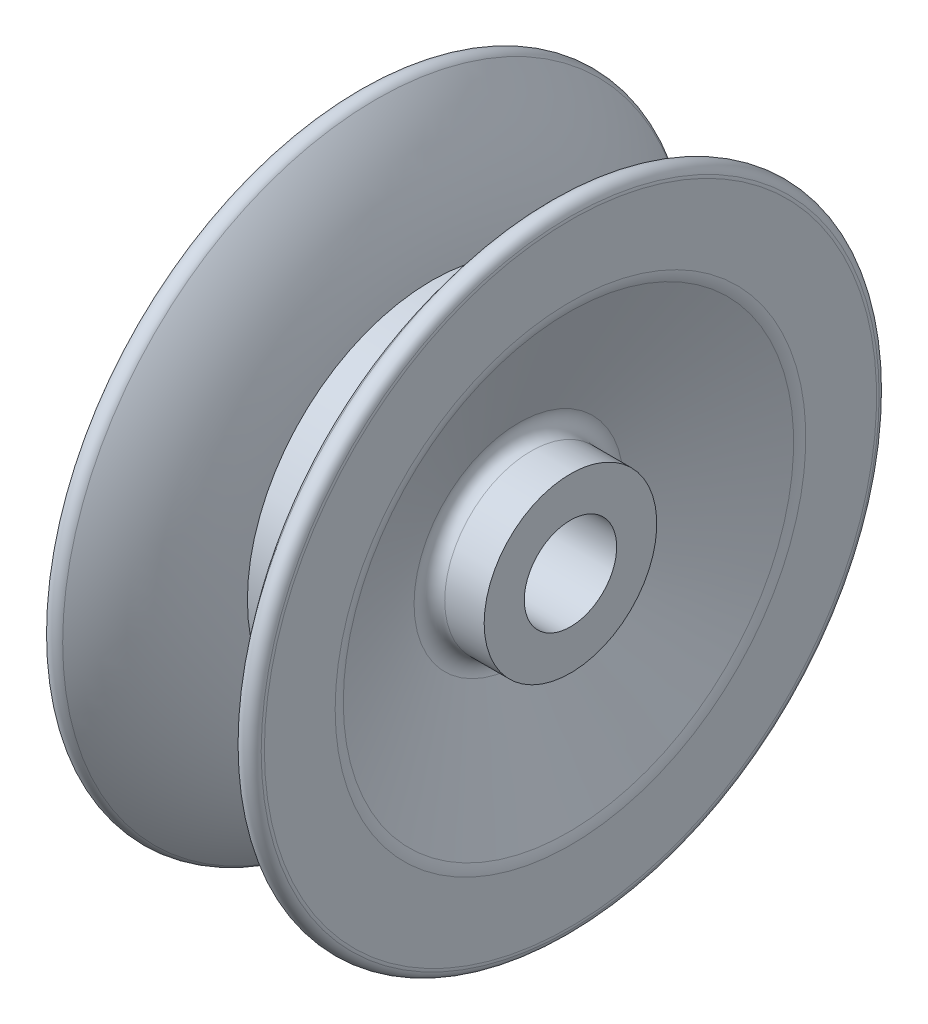
ISO-10303-21;
HEADER;
FILE_DESCRIPTION(('STEP AP214'),'2;1');
FILE_NAME('part.step','',(''),(''),'','','');
FILE_SCHEMA(('AUTOMOTIVE_DESIGN { 1 0 10303 214 1 1 1 1 }'));
ENDSEC;
DATA;
#1=APPLICATION_CONTEXT('core data for automotive mechanical design processes');
#2=APPLICATION_PROTOCOL_DEFINITION('international standard','automotive_design',2000,#1);
#3=PRODUCT_CONTEXT('',#1,'mechanical');
#4=PRODUCT('Part','Part','',(#3));
#5=PRODUCT_RELATED_PRODUCT_CATEGORY('part','',(#4));
#6=PRODUCT_DEFINITION_FORMATION('','',#4);
#7=PRODUCT_DEFINITION_CONTEXT('part definition',#1,'design');
#8=PRODUCT_DEFINITION('design','',#6,#7);
#9=PRODUCT_DEFINITION_SHAPE('','',#8);
#10=(LENGTH_UNIT() NAMED_UNIT(*) SI_UNIT(.MILLI.,.METRE.));
#11=(NAMED_UNIT(*) PLANE_ANGLE_UNIT() SI_UNIT($,.RADIAN.));
#12=(NAMED_UNIT(*) SI_UNIT($,.STERADIAN.) SOLID_ANGLE_UNIT());
#13=UNCERTAINTY_MEASURE_WITH_UNIT(LENGTH_MEASURE(1.E-05),#10,'distance_accuracy_value','');
#14=(GEOMETRIC_REPRESENTATION_CONTEXT(3) GLOBAL_UNCERTAINTY_ASSIGNED_CONTEXT((#13)) GLOBAL_UNIT_ASSIGNED_CONTEXT((#10,
#11,#12)) REPRESENTATION_CONTEXT('',''));
#15=CARTESIAN_POINT('',(0.,0.,0.));
#16=DIRECTION('',(0.,0.,1.));
#17=DIRECTION('',(1.,0.,0.));
#18=AXIS2_PLACEMENT_3D('',#15,#16,#17);
#19=CARTESIAN_POINT('',(-18.5424341477634,21.9704009433962,0.));
#20=DIRECTION('',(-1.,0.,0.));
#21=DIRECTION('',(0.,0.,1.));
#22=AXIS2_PLACEMENT_3D('',#19,#20,#21);
#23=CYLINDRICAL_SURFACE('',#22,11.022641509434);
#24=CARTESIAN_POINT('',(-18.5453741401552,21.9704009433962,0.));
#25=DIRECTION('',(-1.,0.,0.));
#26=DIRECTION('',(0.,0.,1.));
#27=AXIS2_PLACEMENT_3D('',#24,#25,#26);
#28=CIRCLE('',#27,11.022641509434);
#29=CARTESIAN_POINT('',(-18.5453741401552,21.9704009433962,11.022641509434));
#30=VERTEX_POINT('',#29);
#31=EDGE_CURVE('E10',#30,#30,#28,.T.);
#32=ORIENTED_EDGE('',*,*,#31,.T.);
#33=EDGE_LOOP('',(#32));
#34=FACE_BOUND('',#33,.T.);
#35=CARTESIAN_POINT('',(32.2546258598448,21.9704009433962,0.));
#36=DIRECTION('',(-1.,0.,0.));
#37=DIRECTION('',(0.,0.,1.));
#38=AXIS2_PLACEMENT_3D('',#35,#36,#37);
#39=CIRCLE('',#38,11.022641509434);
#40=CARTESIAN_POINT('',(32.2546258598448,21.9704009433962,11.022641509434));
#41=VERTEX_POINT('',#40);
#42=EDGE_CURVE('E95',#41,#41,#39,.T.);
#43=ORIENTED_EDGE('',*,*,#42,.F.);
#44=EDGE_LOOP('',(#43));
#45=FACE_BOUND('',#44,.T.);
#46=ADVANCED_FACE('F31',(#34,#45),#23,.F.);
#47=CARTESIAN_POINT('',(-18.5453741401552,1.38054538428065,0.));
#48=DIRECTION('',(-1.,0.,0.));
#49=DIRECTION('',(0.,0.,1.));
#50=AXIS2_PLACEMENT_3D('',#47,#48,#49);
#51=PLANE('',#50);
#52=CARTESIAN_POINT('',(-18.5453741401552,21.9704009433962,0.));
#53=DIRECTION('',(-1.,0.,0.));
#54=DIRECTION('',(0.,0.,1.));
#55=AXIS2_PLACEMENT_3D('',#52,#53,#54);
#56=CIRCLE('',#55,20.5898555591156);
#57=CARTESIAN_POINT('',(-18.5453741401552,21.9704009433962,20.5898555591156));
#58=VERTEX_POINT('',#57);
#59=EDGE_CURVE('E37',#58,#58,#56,.T.);
#60=ORIENTED_EDGE('',*,*,#59,.T.);
#61=EDGE_LOOP('',(#60));
#62=FACE_BOUND('',#61,.T.);
#63=ORIENTED_EDGE('',*,*,#31,.F.);
#64=EDGE_LOOP('',(#63));
#65=FACE_BOUND('',#64,.T.);
#66=ADVANCED_FACE('F103',(#62,#65),#51,.T.);
#67=CARTESIAN_POINT('',(-18.5424341477634,21.9704009433962,0.));
#68=DIRECTION('',(-1.,0.,0.));
#69=DIRECTION('',(0.,0.,1.));
#70=AXIS2_PLACEMENT_3D('',#67,#68,#69);
#71=CYLINDRICAL_SURFACE('',#70,20.5898555591156);
#72=CARTESIAN_POINT('',(-9.13925862270443,21.9704009433962,0.));
#73=DIRECTION('',(-1.,0.,0.));
#74=DIRECTION('',(0.,0.,1.));
#75=AXIS2_PLACEMENT_3D('',#72,#73,#74);
#76=CIRCLE('',#75,20.5898555591156);
#77=CARTESIAN_POINT('',(-9.13925862270443,21.9704009433962,20.5898555591156));
#78=VERTEX_POINT('',#77);
#79=EDGE_CURVE('E41',#78,#78,#76,.T.);
#80=ORIENTED_EDGE('',*,*,#79,.T.);
#81=EDGE_LOOP('',(#80));
#82=FACE_BOUND('',#81,.T.);
#83=ORIENTED_EDGE('',*,*,#59,.F.);
#84=EDGE_LOOP('',(#83));
#85=FACE_BOUND('',#84,.T.);
#86=ADVANCED_FACE('F107',(#82,#85),#71,.T.);
#87=CARTESIAN_POINT('',(-9.13925862270443,21.9704009433962,0.));
#88=DIRECTION('',(-1.,0.,0.));
#89=DIRECTION('',(0.,0.,1.));
#90=AXIS2_PLACEMENT_3D('',#87,#88,#89);
#91=TOROIDAL_SURFACE('',#90,23.7648555591156,3.175);
#92=CARTESIAN_POINT('',(-6.20433925588989,21.9704009433962,0.));
#93=DIRECTION('',(-1.,0.,0.));
#94=DIRECTION('',(0.,0.,1.));
#95=AXIS2_PLACEMENT_3D('',#92,#93,#94);
#96=CIRCLE('',#95,24.9760010129307);
#97=CARTESIAN_POINT('',(-6.20433925588989,21.9704009433962,24.9760010129307));
#98=VERTEX_POINT('',#97);
#99=EDGE_CURVE('E45',#98,#98,#96,.T.);
#100=ORIENTED_EDGE('',*,*,#99,.T.);
#101=EDGE_LOOP('',(#100));
#102=FACE_BOUND('',#101,.T.);
#103=ORIENTED_EDGE('',*,*,#79,.F.);
#104=EDGE_LOOP('',(#103));
#105=FACE_BOUND('',#104,.T.);
#106=ADVANCED_FACE('F111',(#102,#105),#91,.F.);
#107=CARTESIAN_POINT('',(-6.20433925588989,21.9704009433962,0.));
#108=DIRECTION('',(-1.,0.,0.));
#109=DIRECTION('',(0.,0.,1.));
#110=AXIS2_PLACEMENT_3D('',#107,#108,#109);
#111=CONICAL_SURFACE('',#110,24.9760010129307,1.17941772464008);
#112=CARTESIAN_POINT('',(-18.0652128737843,21.9704009433962,0.));
#113=DIRECTION('',(-1.,0.,0.));
#114=DIRECTION('',(0.,0.,1.));
#115=AXIS2_PLACEMENT_3D('',#112,#113,#114);
#116=CIRCLE('',#115,53.7179721600336);
#117=CARTESIAN_POINT('',(-18.0652128737843,21.9704009433962,53.7179721600336));
#118=VERTEX_POINT('',#117);
#119=EDGE_CURVE('E50',#118,#118,#116,.T.);
#120=ORIENTED_EDGE('',*,*,#119,.T.);
#121=EDGE_LOOP('',(#120));
#122=FACE_BOUND('',#121,.T.);
#123=ORIENTED_EDGE('',*,*,#99,.F.);
#124=EDGE_LOOP('',(#123));
#125=FACE_BOUND('',#124,.T.);
#126=ADVANCED_FACE('F118',(#122,#125),#111,.F.);
#127=CARTESIAN_POINT('',(-12.1953741401552,21.9704009433962,0.));
#128=DIRECTION('',(-1.,0.,0.));
#129=DIRECTION('',(0.,0.,1.));
#130=AXIS2_PLACEMENT_3D('',#127,#128,#129);
#131=TOROIDAL_SURFACE('',#130,56.1402630676638,6.35);
#132=CARTESIAN_POINT('',(-18.5453741401552,21.9704009433962,0.));
#133=DIRECTION('',(-1.,0.,0.));
#134=DIRECTION('',(0.,0.,1.));
#135=AXIS2_PLACEMENT_3D('',#132,#133,#134);
#136=CIRCLE('',#135,56.1402630676638);
#137=CARTESIAN_POINT('',(-18.5453741401552,21.9704009433962,56.1402630676638));
#138=VERTEX_POINT('',#137);
#139=EDGE_CURVE('E53',#138,#138,#136,.T.);
#140=ORIENTED_EDGE('',*,*,#139,.T.);
#141=EDGE_LOOP('',(#140));
#142=FACE_BOUND('',#141,.T.);
#143=ORIENTED_EDGE('',*,*,#119,.F.);
#144=EDGE_LOOP('',(#143));
#145=FACE_BOUND('',#144,.T.);
#146=ADVANCED_FACE('F122',(#142,#145),#131,.T.);
#147=CARTESIAN_POINT('',(-18.5453741401552,-51.0545990799797,0.));
#148=DIRECTION('',(-1.,0.,0.));
#149=DIRECTION('',(0.,0.,1.));
#150=AXIS2_PLACEMENT_3D('',#147,#148,#149);
#151=PLANE('',#150);
#152=CARTESIAN_POINT('',(-18.5453741401552,21.9704009433962,0.));
#153=DIRECTION('',(-1.,0.,0.));
#154=DIRECTION('',(0.,0.,1.));
#155=AXIS2_PLACEMENT_3D('',#152,#153,#154);
#156=CIRCLE('',#155,73.0250000233759);
#157=CARTESIAN_POINT('',(-18.5453741401552,21.9704009433962,73.0250000233759));
#158=VERTEX_POINT('',#157);
#159=EDGE_CURVE('E56',#158,#158,#156,.T.);
#160=ORIENTED_EDGE('',*,*,#159,.T.);
#161=EDGE_LOOP('',(#160));
#162=FACE_BOUND('',#161,.T.);
#163=ORIENTED_EDGE('',*,*,#139,.F.);
#164=EDGE_LOOP('',(#163));
#165=FACE_BOUND('',#164,.T.);
#166=ADVANCED_FACE('F126',(#162,#165),#151,.T.);
#167=CARTESIAN_POINT('',(-15.3703741401552,21.9704009433962,0.));
#168=DIRECTION('',(-1.,0.,0.));
#169=DIRECTION('',(0.,0.,1.));
#170=AXIS2_PLACEMENT_3D('',#167,#168,#169);
#171=TOROIDAL_SURFACE('',#170,73.025000023376,3.175);
#172=CARTESIAN_POINT('',(-18.4709040550846,21.9704009433962,0.));
#173=DIRECTION('',(-1.,0.,0.));
#174=DIRECTION('',(0.,0.,1.));
#175=AXIS2_PLACEMENT_3D('',#172,#173,#174);
#176=CIRCLE('',#175,73.7086221753196);
#177=CARTESIAN_POINT('',(-18.4709040550846,21.9704009433962,73.7086221753196));
#178=VERTEX_POINT('',#177);
#179=EDGE_CURVE('E59',#178,#178,#176,.T.);
#180=ORIENTED_EDGE('',*,*,#179,.T.);
#181=EDGE_LOOP('',(#180));
#182=FACE_BOUND('',#181,.T.);
#183=ORIENTED_EDGE('',*,*,#159,.F.);
#184=EDGE_LOOP('',(#183));
#185=FACE_BOUND('',#184,.T.);
#186=ADVANCED_FACE('F130',(#182,#185),#171,.T.);
#187=CARTESIAN_POINT('',(-15.9904801231411,21.9704009433962,0.));
#188=DIRECTION('',(-1.,0.,0.));
#189=DIRECTION('',(0.,0.,1.));
#190=AXIS2_PLACEMENT_3D('',#187,#188,#189);
#191=TOROIDAL_SURFACE('',#190,73.1617244537647,2.54);
#192=CARTESIAN_POINT('',(-14.0675829673818,21.9704009433962,0.));
#193=DIRECTION('',(-1.,0.,0.));
#194=DIRECTION('',(0.,0.,1.));
#195=AXIS2_PLACEMENT_3D('',#192,#193,#194);
#196=CIRCLE('',#195,74.821262500443);
#197=CARTESIAN_POINT('',(-14.0675829673818,21.9704009433962,74.821262500443));
#198=VERTEX_POINT('',#197);
#199=EDGE_CURVE('E62',#198,#198,#196,.T.);
#200=ORIENTED_EDGE('',*,*,#199,.T.);
#201=EDGE_LOOP('',(#200));
#202=FACE_BOUND('',#201,.T.);
#203=ORIENTED_EDGE('',*,*,#179,.F.);
#204=EDGE_LOOP('',(#203));
#205=FACE_BOUND('',#204,.T.);
#206=ADVANCED_FACE('F134',(#202,#205),#191,.T.);
#207=CARTESIAN_POINT('',(-56.3386038907665,21.9704009433962,0.));
#208=DIRECTION('',(-1.,0.,0.));
#209=DIRECTION('',(0.,0.,1.));
#210=AXIS2_PLACEMENT_3D('',#207,#208,#209);
#211=DEGENERATE_TOROIDAL_SURFACE('',#210,38.33966113961,55.8367840026264,.T.);
#212=CARTESIAN_POINT('',(-0.792288924625871,21.9704009433962,0.));
#213=DIRECTION('',(-1.,0.,0.));
#214=DIRECTION('',(0.,0.,1.));
#215=AXIS2_PLACEMENT_3D('',#212,#213,#214);
#216=CIRCLE('',#215,44.0276609144222);
#217=CARTESIAN_POINT('',(-0.792288924625871,21.9704009433962,44.0276609144222));
#218=VERTEX_POINT('',#217);
#219=EDGE_CURVE('E65',#218,#218,#216,.T.);
#220=ORIENTED_EDGE('',*,*,#219,.T.);
#221=EDGE_LOOP('',(#220));
#222=FACE_BOUND('',#221,.T.);
#223=ORIENTED_EDGE('',*,*,#199,.F.);
#224=EDGE_LOOP('',(#223));
#225=FACE_BOUND('',#224,.T.);
#226=ADVANCED_FACE('F138',(#222,#225),#211,.T.);
#227=CARTESIAN_POINT('',(-18.5424341477634,21.9704009433962,0.));
#228=DIRECTION('',(-1.,0.,0.));
#229=DIRECTION('',(0.,0.,1.));
#230=AXIS2_PLACEMENT_3D('',#227,#228,#229);
#231=CYLINDRICAL_SURFACE('',#230,44.0276609144222);
#232=CARTESIAN_POINT('',(14.5015406443154,21.9704009433962,0.));
#233=DIRECTION('',(-1.,0.,0.));
#234=DIRECTION('',(0.,0.,1.));
#235=AXIS2_PLACEMENT_3D('',#232,#233,#234);
#236=CIRCLE('',#235,44.0276609144222);
#237=CARTESIAN_POINT('',(14.5015406443154,21.9704009433962,44.0276609144222));
#238=VERTEX_POINT('',#237);
#239=EDGE_CURVE('E68',#238,#238,#236,.T.);
#240=ORIENTED_EDGE('',*,*,#239,.T.);
#241=EDGE_LOOP('',(#240));
#242=FACE_BOUND('',#241,.T.);
#243=ORIENTED_EDGE('',*,*,#219,.F.);
#244=EDGE_LOOP('',(#243));
#245=FACE_BOUND('',#244,.T.);
#246=ADVANCED_FACE('F142',(#242,#245),#231,.T.);
#247=CARTESIAN_POINT('',(70.047855610456,21.9704009433962,0.));
#248=DIRECTION('',(-1.,0.,0.));
#249=DIRECTION('',(0.,0.,1.));
#250=AXIS2_PLACEMENT_3D('',#247,#248,#249);
#251=DEGENERATE_TOROIDAL_SURFACE('',#250,38.33966113961,55.8367840026264,.T.);
#252=CARTESIAN_POINT('',(27.7768346870714,21.9704009433962,0.));
#253=DIRECTION('',(-1.,0.,0.));
#254=DIRECTION('',(0.,0.,1.));
#255=AXIS2_PLACEMENT_3D('',#252,#253,#254);
#256=CIRCLE('',#255,74.821262500443);
#257=CARTESIAN_POINT('',(27.7768346870714,21.9704009433962,74.821262500443));
#258=VERTEX_POINT('',#257);
#259=EDGE_CURVE('E71',#258,#258,#256,.T.);
#260=ORIENTED_EDGE('',*,*,#259,.T.);
#261=EDGE_LOOP('',(#260));
#262=FACE_BOUND('',#261,.T.);
#263=ORIENTED_EDGE('',*,*,#239,.F.);
#264=EDGE_LOOP('',(#263));
#265=FACE_BOUND('',#264,.T.);
#266=ADVANCED_FACE('F146',(#262,#265),#251,.T.);
#267=CARTESIAN_POINT('',(29.6997318428306,21.9704009433962,0.));
#268=DIRECTION('',(-1.,0.,0.));
#269=DIRECTION('',(0.,0.,1.));
#270=AXIS2_PLACEMENT_3D('',#267,#268,#269);
#271=TOROIDAL_SURFACE('',#270,73.1617244537647,2.54);
#272=CARTESIAN_POINT('',(32.1801557747741,21.9704009433962,0.));
#273=DIRECTION('',(-1.,0.,0.));
#274=DIRECTION('',(0.,0.,1.));
#275=AXIS2_PLACEMENT_3D('',#272,#273,#274);
#276=CIRCLE('',#275,73.7086221753196);
#277=CARTESIAN_POINT('',(32.1801557747741,21.9704009433962,73.7086221753196));
#278=VERTEX_POINT('',#277);
#279=EDGE_CURVE('E74',#278,#278,#276,.T.);
#280=ORIENTED_EDGE('',*,*,#279,.T.);
#281=EDGE_LOOP('',(#280));
#282=FACE_BOUND('',#281,.T.);
#283=ORIENTED_EDGE('',*,*,#259,.F.);
#284=EDGE_LOOP('',(#283));
#285=FACE_BOUND('',#284,.T.);
#286=ADVANCED_FACE('F150',(#282,#285),#271,.T.);
#287=CARTESIAN_POINT('',(29.0796258598448,21.9704009433962,0.));
#288=DIRECTION('',(-1.,0.,0.));
#289=DIRECTION('',(0.,0.,1.));
#290=AXIS2_PLACEMENT_3D('',#287,#288,#289);
#291=TOROIDAL_SURFACE('',#290,73.025000023376,3.175);
#292=CARTESIAN_POINT('',(32.2546258598448,21.9704009433962,0.));
#293=DIRECTION('',(-1.,0.,0.));
#294=DIRECTION('',(0.,0.,1.));
#295=AXIS2_PLACEMENT_3D('',#292,#293,#294);
#296=CIRCLE('',#295,73.0250000233759);
#297=CARTESIAN_POINT('',(32.2546258598448,21.9704009433962,73.0250000233759));
#298=VERTEX_POINT('',#297);
#299=EDGE_CURVE('E77',#298,#298,#296,.T.);
#300=ORIENTED_EDGE('',*,*,#299,.T.);
#301=EDGE_LOOP('',(#300));
#302=FACE_BOUND('',#301,.T.);
#303=ORIENTED_EDGE('',*,*,#279,.F.);
#304=EDGE_LOOP('',(#303));
#305=FACE_BOUND('',#304,.T.);
#306=ADVANCED_FACE('F154',(#302,#305),#291,.T.);
#307=CARTESIAN_POINT('',(32.2546258598448,-51.0545990799797,0.));
#308=DIRECTION('',(1.,0.,0.));
#309=DIRECTION('',(0.,0.,-1.));
#310=AXIS2_PLACEMENT_3D('',#307,#308,#309);
#311=PLANE('',#310);
#312=CARTESIAN_POINT('',(32.2546258598448,21.9704009433962,0.));
#313=DIRECTION('',(-1.,0.,0.));
#314=DIRECTION('',(0.,0.,1.));
#315=AXIS2_PLACEMENT_3D('',#312,#313,#314);
#316=CIRCLE('',#315,56.1402630676638);
#317=CARTESIAN_POINT('',(32.2546258598448,21.9704009433962,56.1402630676638));
#318=VERTEX_POINT('',#317);
#319=EDGE_CURVE('E80',#318,#318,#316,.T.);
#320=ORIENTED_EDGE('',*,*,#319,.T.);
#321=EDGE_LOOP('',(#320));
#322=FACE_BOUND('',#321,.T.);
#323=ORIENTED_EDGE('',*,*,#299,.F.);
#324=EDGE_LOOP('',(#323));
#325=FACE_BOUND('',#324,.T.);
#326=ADVANCED_FACE('F158',(#322,#325),#311,.T.);
#327=CARTESIAN_POINT('',(25.9046258598448,21.9704009433962,0.));
#328=DIRECTION('',(-1.,0.,0.));
#329=DIRECTION('',(0.,0.,1.));
#330=AXIS2_PLACEMENT_3D('',#327,#328,#329);
#331=TOROIDAL_SURFACE('',#330,56.1402630676638,6.35);
#332=CARTESIAN_POINT('',(31.7744645934738,21.9704009433962,0.));
#333=DIRECTION('',(-1.,0.,0.));
#334=DIRECTION('',(0.,0.,1.));
#335=AXIS2_PLACEMENT_3D('',#332,#333,#334);
#336=CIRCLE('',#335,53.7179721600336);
#337=CARTESIAN_POINT('',(31.7744645934738,21.9704009433962,53.7179721600336));
#338=VERTEX_POINT('',#337);
#339=EDGE_CURVE('E83',#338,#338,#336,.T.);
#340=ORIENTED_EDGE('',*,*,#339,.T.);
#341=EDGE_LOOP('',(#340));
#342=FACE_BOUND('',#341,.T.);
#343=ORIENTED_EDGE('',*,*,#319,.F.);
#344=EDGE_LOOP('',(#343));
#345=FACE_BOUND('',#344,.T.);
#346=ADVANCED_FACE('F162',(#342,#345),#331,.T.);
#347=CARTESIAN_POINT('',(31.7744645934738,21.9704009433962,0.));
#348=DIRECTION('',(1.,0.,0.));
#349=DIRECTION('',(0.,0.,-1.));
#350=AXIS2_PLACEMENT_3D('',#347,#348,#349);
#351=CONICAL_SURFACE('',#350,53.7179721600336,1.17941772464008);
#352=CARTESIAN_POINT('',(19.9135909755794,21.9704009433962,0.));
#353=DIRECTION('',(-1.,0.,0.));
#354=DIRECTION('',(0.,0.,1.));
#355=AXIS2_PLACEMENT_3D('',#352,#353,#354);
#356=CIRCLE('',#355,24.9760010129307);
#357=CARTESIAN_POINT('',(19.9135909755794,21.9704009433962,24.9760010129307));
#358=VERTEX_POINT('',#357);
#359=EDGE_CURVE('E86',#358,#358,#356,.T.);
#360=ORIENTED_EDGE('',*,*,#359,.T.);
#361=EDGE_LOOP('',(#360));
#362=FACE_BOUND('',#361,.T.);
#363=ORIENTED_EDGE('',*,*,#339,.F.);
#364=EDGE_LOOP('',(#363));
#365=FACE_BOUND('',#364,.T.);
#366=ADVANCED_FACE('F166',(#362,#365),#351,.F.);
#367=CARTESIAN_POINT('',(22.848510342394,21.9704009433962,0.));
#368=DIRECTION('',(-1.,0.,0.));
#369=DIRECTION('',(0.,0.,1.));
#370=AXIS2_PLACEMENT_3D('',#367,#368,#369);
#371=TOROIDAL_SURFACE('',#370,23.7648555591156,3.175);
#372=CARTESIAN_POINT('',(22.848510342394,21.9704009433962,0.));
#373=DIRECTION('',(-1.,0.,0.));
#374=DIRECTION('',(0.,0.,1.));
#375=AXIS2_PLACEMENT_3D('',#372,#373,#374);
#376=CIRCLE('',#375,20.5898555591156);
#377=CARTESIAN_POINT('',(22.848510342394,21.9704009433962,20.5898555591156));
#378=VERTEX_POINT('',#377);
#379=EDGE_CURVE('E89',#378,#378,#376,.T.);
#380=ORIENTED_EDGE('',*,*,#379,.T.);
#381=EDGE_LOOP('',(#380));
#382=FACE_BOUND('',#381,.T.);
#383=ORIENTED_EDGE('',*,*,#359,.F.);
#384=EDGE_LOOP('',(#383));
#385=FACE_BOUND('',#384,.T.);
#386=ADVANCED_FACE('F170',(#382,#385),#371,.F.);
#387=CARTESIAN_POINT('',(-18.5424341477634,21.9704009433962,0.));
#388=DIRECTION('',(-1.,0.,0.));
#389=DIRECTION('',(0.,0.,1.));
#390=AXIS2_PLACEMENT_3D('',#387,#388,#389);
#391=CYLINDRICAL_SURFACE('',#390,20.5898555591156);
#392=CARTESIAN_POINT('',(32.2546258598448,21.9704009433962,0.));
#393=DIRECTION('',(-1.,0.,0.));
#394=DIRECTION('',(0.,0.,1.));
#395=AXIS2_PLACEMENT_3D('',#392,#393,#394);
#396=CIRCLE('',#395,20.5898555591156);
#397=CARTESIAN_POINT('',(32.2546258598448,21.9704009433962,20.5898555591156));
#398=VERTEX_POINT('',#397);
#399=EDGE_CURVE('E92',#398,#398,#396,.T.);
#400=ORIENTED_EDGE('',*,*,#399,.T.);
#401=EDGE_LOOP('',(#400));
#402=FACE_BOUND('',#401,.T.);
#403=ORIENTED_EDGE('',*,*,#379,.F.);
#404=EDGE_LOOP('',(#403));
#405=FACE_BOUND('',#404,.T.);
#406=ADVANCED_FACE('F174',(#402,#405),#391,.T.);
#407=CARTESIAN_POINT('',(32.2546258598448,1.38054538428065,0.));
#408=DIRECTION('',(1.,0.,0.));
#409=DIRECTION('',(0.,0.,-1.));
#410=AXIS2_PLACEMENT_3D('',#407,#408,#409);
#411=PLANE('',#410);
#412=ORIENTED_EDGE('',*,*,#42,.T.);
#413=EDGE_LOOP('',(#412));
#414=FACE_BOUND('',#413,.T.);
#415=ORIENTED_EDGE('',*,*,#399,.F.);
#416=EDGE_LOOP('',(#415));
#417=FACE_BOUND('',#416,.T.);
#418=ADVANCED_FACE('F99',(#414,#417),#411,.T.);
#419=CLOSED_SHELL('',(#46,#66,#86,#106,#126,#146,#166,#186,#206,#226,#246,#266,#286,#306,#326,
#346,#366,#386,#406,#418));
#420=MANIFOLD_SOLID_BREP('B2',#419);
#421=ADVANCED_BREP_SHAPE_REPRESENTATION('',(#18,#420),#14);
#422=SHAPE_DEFINITION_REPRESENTATION(#9,#421);
ENDSEC;
END-ISO-10303-21;
